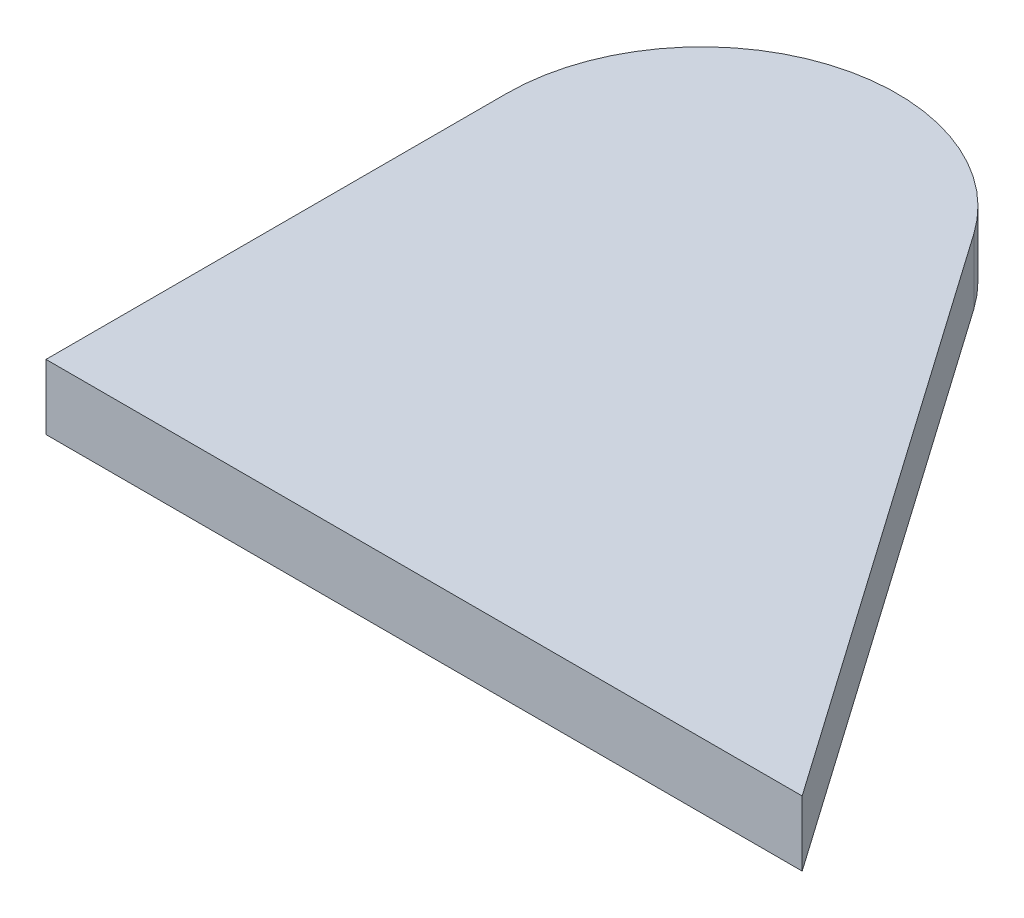
ISO-10303-21;
HEADER;
FILE_DESCRIPTION(('STEP AP214'),'2;1');
FILE_NAME('part.step','',(''),(''),'','','');
FILE_SCHEMA(('AUTOMOTIVE_DESIGN { 1 0 10303 214 1 1 1 1 }'));
ENDSEC;
DATA;
#1=APPLICATION_CONTEXT('core data for automotive mechanical design processes');
#2=APPLICATION_PROTOCOL_DEFINITION('international standard','automotive_design',2000,#1);
#3=PRODUCT_CONTEXT('',#1,'mechanical');
#4=PRODUCT('Part','Part','',(#3));
#5=PRODUCT_RELATED_PRODUCT_CATEGORY('part','',(#4));
#6=PRODUCT_DEFINITION_FORMATION('','',#4);
#7=PRODUCT_DEFINITION_CONTEXT('part definition',#1,'design');
#8=PRODUCT_DEFINITION('design','',#6,#7);
#9=PRODUCT_DEFINITION_SHAPE('','',#8);
#10=(LENGTH_UNIT() NAMED_UNIT(*) SI_UNIT(.MILLI.,.METRE.));
#11=(NAMED_UNIT(*) PLANE_ANGLE_UNIT() SI_UNIT($,.RADIAN.));
#12=(NAMED_UNIT(*) SI_UNIT($,.STERADIAN.) SOLID_ANGLE_UNIT());
#13=UNCERTAINTY_MEASURE_WITH_UNIT(LENGTH_MEASURE(1.E-05),#10,'distance_accuracy_value','');
#14=(GEOMETRIC_REPRESENTATION_CONTEXT(3) GLOBAL_UNCERTAINTY_ASSIGNED_CONTEXT((#13)) GLOBAL_UNIT_ASSIGNED_CONTEXT((#10,
#11,#12)) REPRESENTATION_CONTEXT('',''));
#15=CARTESIAN_POINT('',(0.,0.,0.));
#16=DIRECTION('',(0.,0.,1.));
#17=DIRECTION('',(1.,0.,0.));
#18=AXIS2_PLACEMENT_3D('',#15,#16,#17);
#19=CARTESIAN_POINT('',(19.05,6.35,-44.9224594153122));
#20=DIRECTION('',(0.,-1.,0.));
#21=DIRECTION('',(0.,0.,-1.));
#22=AXIS2_PLACEMENT_3D('',#19,#20,#21);
#23=CYLINDRICAL_SURFACE('',#22,19.05);
#24=CARTESIAN_POINT('',(19.05,0.,-44.9224594153122));
#25=DIRECTION('',(0.,1.,0.));
#26=DIRECTION('',(0.,0.,1.));
#27=AXIS2_PLACEMENT_3D('',#24,#25,#26);
#28=CIRCLE('',#27,19.05);
#29=CARTESIAN_POINT('',(34.6548464437052,0.,-55.8490905277997));
#30=VERTEX_POINT('',#29);
#31=CARTESIAN_POINT('',(0.,0.,-44.9224594153122));
#32=VERTEX_POINT('',#31);
#33=EDGE_CURVE('E108',#30,#32,#28,.T.);
#34=ORIENTED_EDGE('',*,*,#33,.T.);
#35=DIRECTION('',(0.,-1.,0.));
#36=VECTOR('',#35,1.);
#37=CARTESIAN_POINT('',(0.,6.35,-44.9224594153122));
#38=LINE('',#37,#36);
#39=CARTESIAN_POINT('',(0.,6.35,-44.9224594153122));
#40=VERTEX_POINT('',#39);
#41=EDGE_CURVE('E11',#40,#32,#38,.T.);
#42=ORIENTED_EDGE('',*,*,#41,.F.);
#43=CARTESIAN_POINT('',(19.05,6.35,-44.9224594153122));
#44=DIRECTION('',(0.,1.,0.));
#45=DIRECTION('',(0.,0.,1.));
#46=AXIS2_PLACEMENT_3D('',#43,#44,#45);
#47=CIRCLE('',#46,19.05);
#48=CARTESIAN_POINT('',(34.6548464437052,6.35,-55.8490905277997));
#49=VERTEX_POINT('',#48);
#50=EDGE_CURVE('E82',#49,#40,#47,.T.);
#51=ORIENTED_EDGE('',*,*,#50,.F.);
#52=DIRECTION('',(0.,-1.,0.));
#53=VECTOR('',#52,1.);
#54=CARTESIAN_POINT('',(34.6548464437052,6.35,-55.8490905277997));
#55=LINE('',#54,#53);
#56=EDGE_CURVE('E107',#49,#30,#55,.T.);
#57=ORIENTED_EDGE('',*,*,#56,.T.);
#58=EDGE_LOOP('',(#34,#42,#51,#57));
#59=FACE_BOUND('',#58,.T.);
#60=ADVANCED_FACE('F39',(#59),#23,.T.);
#61=CARTESIAN_POINT('',(0.,6.35,0.));
#62=DIRECTION('',(-1.,0.,0.));
#63=DIRECTION('',(0.,0.,1.));
#64=AXIS2_PLACEMENT_3D('',#61,#62,#63);
#65=PLANE('',#64);
#66=DIRECTION('',(0.,0.,-1.));
#67=VECTOR('',#66,1.);
#68=CARTESIAN_POINT('',(0.,0.,0.));
#69=LINE('',#68,#67);
#70=CARTESIAN_POINT('',(0.,0.,0.));
#71=VERTEX_POINT('',#70);
#72=EDGE_CURVE('E92',#71,#32,#69,.T.);
#73=ORIENTED_EDGE('',*,*,#72,.F.);
#74=DIRECTION('',(0.,-1.,0.));
#75=VECTOR('',#74,1.);
#76=CARTESIAN_POINT('',(0.,6.35,0.));
#77=LINE('',#76,#75);
#78=CARTESIAN_POINT('',(0.,6.35,0.));
#79=VERTEX_POINT('',#78);
#80=EDGE_CURVE('E48',#79,#71,#77,.T.);
#81=ORIENTED_EDGE('',*,*,#80,.F.);
#82=DIRECTION('',(0.,0.,-1.));
#83=VECTOR('',#82,1.);
#84=CARTESIAN_POINT('',(0.,6.35,0.));
#85=LINE('',#84,#83);
#86=EDGE_CURVE('E90',#79,#40,#85,.T.);
#87=ORIENTED_EDGE('',*,*,#86,.T.);
#88=ORIENTED_EDGE('',*,*,#41,.T.);
#89=EDGE_LOOP('',(#73,#81,#87,#88));
#90=FACE_BOUND('',#89,.T.);
#91=ADVANCED_FACE('F89',(#90),#65,.T.);
#92=CARTESIAN_POINT('',(19.05,6.35,0.));
#93=DIRECTION('',(0.,0.,-1.));
#94=DIRECTION('',(-1.,0.,0.));
#95=AXIS2_PLACEMENT_3D('',#92,#93,#94);
#96=PLANE('',#95);
#97=DIRECTION('',(1.,0.,0.));
#98=VECTOR('',#97,1.);
#99=CARTESIAN_POINT('',(19.05,0.,0.));
#100=LINE('',#99,#98);
#101=CARTESIAN_POINT('',(73.7608006334275,0.,0.));
#102=VERTEX_POINT('',#101);
#103=EDGE_CURVE('E71',#71,#102,#100,.T.);
#104=ORIENTED_EDGE('',*,*,#103,.T.);
#105=DIRECTION('',(0.,-1.,0.));
#106=VECTOR('',#105,1.);
#107=CARTESIAN_POINT('',(73.7608006334275,6.35,0.));
#108=LINE('',#107,#106);
#109=CARTESIAN_POINT('',(73.7608006334275,6.35,0.));
#110=VERTEX_POINT('',#109);
#111=EDGE_CURVE('E94',#110,#102,#108,.T.);
#112=ORIENTED_EDGE('',*,*,#111,.F.);
#113=DIRECTION('',(1.,0.,0.));
#114=VECTOR('',#113,1.);
#115=CARTESIAN_POINT('',(0.,6.35,0.));
#116=LINE('',#115,#114);
#117=EDGE_CURVE('E95',#79,#110,#116,.T.);
#118=ORIENTED_EDGE('',*,*,#117,.F.);
#119=ORIENTED_EDGE('',*,*,#80,.T.);
#120=EDGE_LOOP('',(#104,#112,#118,#119));
#121=FACE_BOUND('',#120,.T.);
#122=ADVANCED_FACE('F96',(#121),#96,.F.);
#123=CARTESIAN_POINT('',(73.7608006334275,6.35,0.));
#124=DIRECTION('',(-0.819152044288989,0.,0.57357643635105));
#125=DIRECTION('',(0.57357643635105,0.,0.819152044288989));
#126=AXIS2_PLACEMENT_3D('',#123,#124,#125);
#127=PLANE('',#126);
#128=DIRECTION('',(-0.57357643635105,0.,-0.819152044288989));
#129=VECTOR('',#128,1.);
#130=CARTESIAN_POINT('',(73.7608006334275,0.,0.));
#131=LINE('',#130,#129);
#132=EDGE_CURVE('E77',#102,#30,#131,.T.);
#133=ORIENTED_EDGE('',*,*,#132,.T.);
#134=ORIENTED_EDGE('',*,*,#56,.F.);
#135=DIRECTION('',(-0.57357643635105,0.,-0.819152044288989));
#136=VECTOR('',#135,1.);
#137=CARTESIAN_POINT('',(73.7608006334275,6.35,0.));
#138=LINE('',#137,#136);
#139=EDGE_CURVE('E56',#110,#49,#138,.T.);
#140=ORIENTED_EDGE('',*,*,#139,.F.);
#141=ORIENTED_EDGE('',*,*,#111,.T.);
#142=EDGE_LOOP('',(#133,#134,#140,#141));
#143=FACE_BOUND('',#142,.T.);
#144=ADVANCED_FACE('F121',(#143),#127,.F.);
#145=CARTESIAN_POINT('',(19.05,6.35,-44.9224594153122));
#146=DIRECTION('',(0.,1.,0.));
#147=DIRECTION('',(0.,0.,1.));
#148=AXIS2_PLACEMENT_3D('',#145,#146,#147);
#149=PLANE('',#148);
#150=ORIENTED_EDGE('',*,*,#50,.T.);
#151=ORIENTED_EDGE('',*,*,#86,.F.);
#152=ORIENTED_EDGE('',*,*,#117,.T.);
#153=ORIENTED_EDGE('',*,*,#139,.T.);
#154=EDGE_LOOP('',(#150,#151,#152,#153));
#155=FACE_BOUND('',#154,.T.);
#156=ADVANCED_FACE('F99',(#155),#149,.T.);
#157=CARTESIAN_POINT('',(19.05,0.,-44.9224594153122));
#158=DIRECTION('',(0.,1.,0.));
#159=DIRECTION('',(0.,0.,1.));
#160=AXIS2_PLACEMENT_3D('',#157,#158,#159);
#161=PLANE('',#160);
#162=ORIENTED_EDGE('',*,*,#33,.F.);
#163=ORIENTED_EDGE('',*,*,#132,.F.);
#164=ORIENTED_EDGE('',*,*,#103,.F.);
#165=ORIENTED_EDGE('',*,*,#72,.T.);
#166=EDGE_LOOP('',(#162,#163,#164,#165));
#167=FACE_BOUND('',#166,.T.);
#168=ADVANCED_FACE('F124',(#167),#161,.F.);
#169=CLOSED_SHELL('',(#60,#91,#122,#144,#156,#168));
#170=MANIFOLD_SOLID_BREP('B2',#169);
#171=ADVANCED_BREP_SHAPE_REPRESENTATION('',(#18,#170),#14);
#172=SHAPE_DEFINITION_REPRESENTATION(#9,#171);
ENDSEC;
END-ISO-10303-21;
